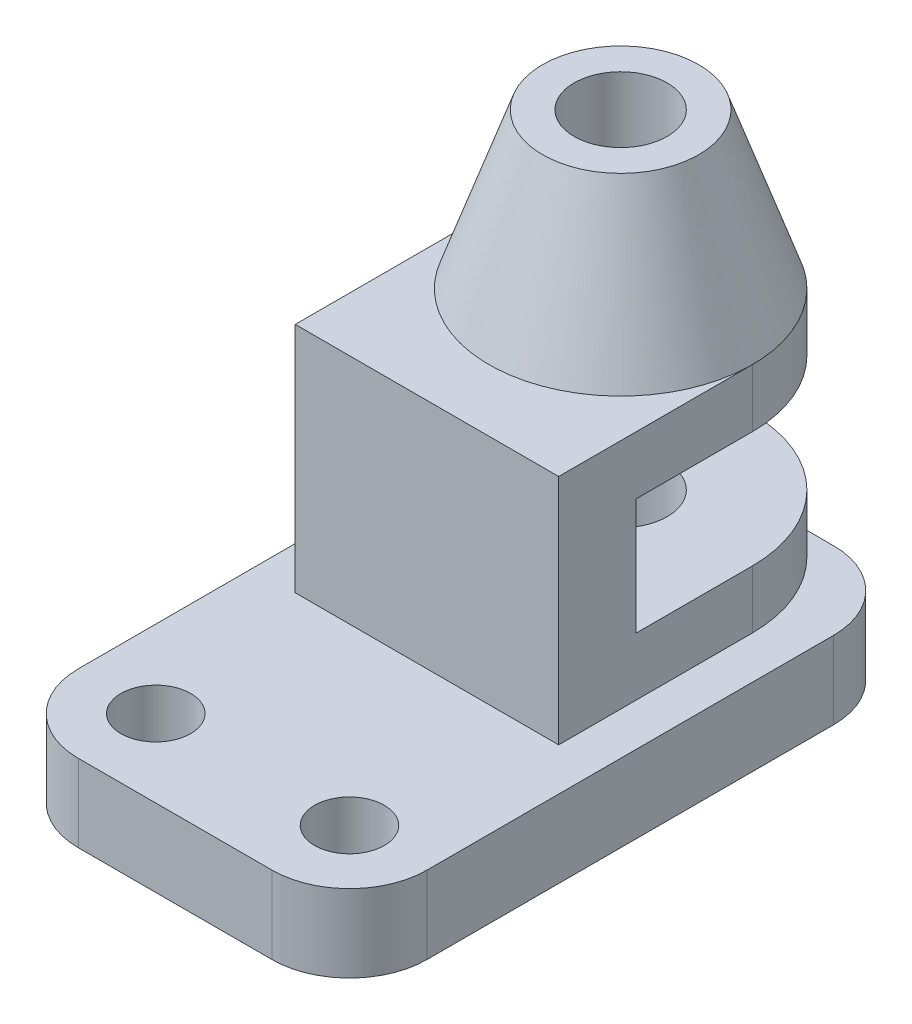
ISO-10303-21;
HEADER;
FILE_DESCRIPTION(('STEP AP214'),'2;1');
FILE_NAME('part.step','',(''),(''),'','','');
FILE_SCHEMA(('AUTOMOTIVE_DESIGN { 1 0 10303 214 1 1 1 1 }'));
ENDSEC;
DATA;
#1=APPLICATION_CONTEXT('core data for automotive mechanical design processes');
#2=APPLICATION_PROTOCOL_DEFINITION('international standard','automotive_design',2000,#1);
#3=PRODUCT_CONTEXT('',#1,'mechanical');
#4=PRODUCT('Part','Part','',(#3));
#5=PRODUCT_RELATED_PRODUCT_CATEGORY('part','',(#4));
#6=PRODUCT_DEFINITION_FORMATION('','',#4);
#7=PRODUCT_DEFINITION_CONTEXT('part definition',#1,'design');
#8=PRODUCT_DEFINITION('design','',#6,#7);
#9=PRODUCT_DEFINITION_SHAPE('','',#8);
#10=(LENGTH_UNIT() NAMED_UNIT(*) SI_UNIT(.MILLI.,.METRE.));
#11=(NAMED_UNIT(*) PLANE_ANGLE_UNIT() SI_UNIT($,.RADIAN.));
#12=(NAMED_UNIT(*) SI_UNIT($,.STERADIAN.) SOLID_ANGLE_UNIT());
#13=UNCERTAINTY_MEASURE_WITH_UNIT(LENGTH_MEASURE(1.E-05),#10,'distance_accuracy_value','');
#14=(GEOMETRIC_REPRESENTATION_CONTEXT(3) GLOBAL_UNCERTAINTY_ASSIGNED_CONTEXT((#13)) GLOBAL_UNIT_ASSIGNED_CONTEXT((#10,
#11,#12)) REPRESENTATION_CONTEXT('',''));
#15=CARTESIAN_POINT('',(0.,0.,0.));
#16=DIRECTION('',(0.,0.,1.));
#17=DIRECTION('',(1.,0.,0.));
#18=AXIS2_PLACEMENT_3D('',#15,#16,#17);
#19=CARTESIAN_POINT('',(16.2896405919663,120.,-115.));
#20=DIRECTION('',(0.,-1.,0.));
#21=DIRECTION('',(0.,0.,-1.));
#22=AXIS2_PLACEMENT_3D('',#19,#20,#21);
#23=PLANE('',#22);
#24=CARTESIAN_POINT('',(16.2896405919663,120.,-115.));
#25=DIRECTION('',(0.,1.,0.));
#26=DIRECTION('',(0.,0.,1.));
#27=AXIS2_PLACEMENT_3D('',#24,#25,#26);
#28=CIRCLE('',#27,12.);
#29=CARTESIAN_POINT('',(16.2896405919663,120.,-103.));
#30=VERTEX_POINT('',#29);
#31=EDGE_CURVE('E60',#30,#30,#28,.T.);
#32=ORIENTED_EDGE('',*,*,#31,.F.);
#33=EDGE_LOOP('',(#32));
#34=FACE_BOUND('',#33,.T.);
#35=CARTESIAN_POINT('',(16.2896405919663,120.,-115.));
#36=DIRECTION('',(0.,-1.,0.));
#37=DIRECTION('',(0.,0.,-1.));
#38=AXIS2_PLACEMENT_3D('',#35,#36,#37);
#39=CIRCLE('',#38,20.1495466843034);
#40=CARTESIAN_POINT('',(16.2896405919663,120.,-135.149546684303));
#41=VERTEX_POINT('',#40);
#42=EDGE_CURVE('E54',#41,#41,#39,.T.);
#43=ORIENTED_EDGE('',*,*,#42,.F.);
#44=EDGE_LOOP('',(#43));
#45=FACE_BOUND('',#44,.T.);
#46=ADVANCED_FACE('F47',(#34,#45),#23,.F.);
#47=CARTESIAN_POINT('',(16.2896405919663,80.,-149.));
#48=DIRECTION('',(0.,1.,0.));
#49=DIRECTION('',(0.,0.,1.));
#50=AXIS2_PLACEMENT_3D('',#47,#48,#49);
#51=PLANE('',#50);
#52=CARTESIAN_POINT('',(16.2896405919663,80.,-115.));
#53=DIRECTION('',(0.,1.,0.));
#54=DIRECTION('',(0.,0.,1.));
#55=AXIS2_PLACEMENT_3D('',#52,#53,#54);
#56=CIRCLE('',#55,12.);
#57=CARTESIAN_POINT('',(16.2896405919663,80.,-103.));
#58=VERTEX_POINT('',#57);
#59=EDGE_CURVE('E50',#58,#58,#56,.T.);
#60=ORIENTED_EDGE('',*,*,#59,.T.);
#61=EDGE_LOOP('',(#60));
#62=FACE_BOUND('',#61,.T.);
#63=CARTESIAN_POINT('',(16.2896405919663,80.,-115.));
#64=DIRECTION('',(0.,-1.,0.));
#65=DIRECTION('',(0.,0.,-1.));
#66=AXIS2_PLACEMENT_3D('',#63,#64,#65);
#67=CIRCLE('',#66,34.);
#68=CARTESIAN_POINT('',(16.2896405919663,80.,-149.));
#69=VERTEX_POINT('',#68);
#70=EDGE_CURVE('E11',#69,#69,#67,.T.);
#71=ORIENTED_EDGE('',*,*,#70,.T.);
#72=EDGE_LOOP('',(#71));
#73=FACE_BOUND('',#72,.T.);
#74=ADVANCED_FACE('F67',(#62,#73),#51,.F.);
#75=CARTESIAN_POINT('',(16.2896405919663,120.,-115.));
#76=DIRECTION('',(0.,-1.,0.));
#77=DIRECTION('',(0.,0.,-1.));
#78=AXIS2_PLACEMENT_3D('',#75,#76,#77);
#79=CONICAL_SURFACE('',#78,20.1495466843034,0.333340283437844);
#80=ORIENTED_EDGE('',*,*,#70,.F.);
#81=EDGE_LOOP('',(#80));
#82=FACE_BOUND('',#81,.T.);
#83=ORIENTED_EDGE('',*,*,#42,.T.);
#84=EDGE_LOOP('',(#83));
#85=FACE_BOUND('',#84,.T.);
#86=ADVANCED_FACE('F71',(#82,#85),#79,.T.);
#87=CARTESIAN_POINT('',(16.2896405919663,0.,-115.));
#88=DIRECTION('',(0.,1.,0.));
#89=DIRECTION('',(0.,0.,1.));
#90=AXIS2_PLACEMENT_3D('',#87,#88,#89);
#91=CYLINDRICAL_SURFACE('',#90,12.);
#92=CARTESIAN_POINT('',(16.2896405919663,120.,-103.));
#93=CARTESIAN_POINT('',(16.2896405919663,119.583333333333,-103.));
#94=CARTESIAN_POINT('',(16.2896405919663,119.166666666667,-103.));
#95=CARTESIAN_POINT('',(16.2896405919663,118.333333333333,-103.));
#96=CARTESIAN_POINT('',(16.2896405919663,117.916666666667,-103.));
#97=CARTESIAN_POINT('',(16.2896405919663,117.083333333333,-103.));
#98=CARTESIAN_POINT('',(16.2896405919663,116.666666666667,-103.));
#99=CARTESIAN_POINT('',(16.2896405919663,115.833333333333,-103.));
#100=CARTESIAN_POINT('',(16.2896405919663,115.416666666667,-103.));
#101=CARTESIAN_POINT('',(16.2896405919663,114.583333333333,-103.));
#102=CARTESIAN_POINT('',(16.2896405919663,114.166666666667,-103.));
#103=CARTESIAN_POINT('',(16.2896405919663,113.333333333333,-103.));
#104=CARTESIAN_POINT('',(16.2896405919663,112.916666666667,-103.));
#105=CARTESIAN_POINT('',(16.2896405919663,112.083333333333,-103.));
#106=CARTESIAN_POINT('',(16.2896405919663,111.666666666667,-103.));
#107=CARTESIAN_POINT('',(16.2896405919663,110.833333333333,-103.));
#108=CARTESIAN_POINT('',(16.2896405919663,110.416666666667,-103.));
#109=CARTESIAN_POINT('',(16.2896405919663,109.583333333333,-103.));
#110=CARTESIAN_POINT('',(16.2896405919663,109.166666666667,-103.));
#111=CARTESIAN_POINT('',(16.2896405919663,108.333333333333,-103.));
#112=CARTESIAN_POINT('',(16.2896405919663,107.916666666667,-103.));
#113=CARTESIAN_POINT('',(16.2896405919663,107.083333333333,-103.));
#114=CARTESIAN_POINT('',(16.2896405919663,106.666666666667,-103.));
#115=CARTESIAN_POINT('',(16.2896405919663,105.833333333333,-103.));
#116=CARTESIAN_POINT('',(16.2896405919663,105.416666666667,-103.));
#117=CARTESIAN_POINT('',(16.2896405919663,104.583333333333,-103.));
#118=CARTESIAN_POINT('',(16.2896405919663,104.166666666667,-103.));
#119=CARTESIAN_POINT('',(16.2896405919663,103.333333333333,-103.));
#120=CARTESIAN_POINT('',(16.2896405919663,102.916666666667,-103.));
#121=CARTESIAN_POINT('',(16.2896405919663,102.083333333333,-103.));
#122=CARTESIAN_POINT('',(16.2896405919663,101.666666666667,-103.));
#123=CARTESIAN_POINT('',(16.2896405919663,100.833333333333,-103.));
#124=CARTESIAN_POINT('',(16.2896405919663,100.416666666667,-103.));
#125=CARTESIAN_POINT('',(16.2896405919663,99.5833333333333,-103.));
#126=CARTESIAN_POINT('',(16.2896405919663,99.1666666666666,-103.));
#127=CARTESIAN_POINT('',(16.2896405919663,98.3333333333333,-103.));
#128=CARTESIAN_POINT('',(16.2896405919663,97.9166666666666,-103.));
#129=CARTESIAN_POINT('',(16.2896405919663,97.0833333333333,-103.));
#130=CARTESIAN_POINT('',(16.2896405919663,96.6666666666666,-103.));
#131=CARTESIAN_POINT('',(16.2896405919663,95.8333333333333,-103.));
#132=CARTESIAN_POINT('',(16.2896405919663,95.4166666666666,-103.));
#133=CARTESIAN_POINT('',(16.2896405919663,94.5833333333333,-103.));
#134=CARTESIAN_POINT('',(16.2896405919663,94.1666666666666,-103.));
#135=CARTESIAN_POINT('',(16.2896405919663,93.3333333333333,-103.));
#136=CARTESIAN_POINT('',(16.2896405919663,92.9166666666666,-103.));
#137=CARTESIAN_POINT('',(16.2896405919663,92.0833333333333,-103.));
#138=CARTESIAN_POINT('',(16.2896405919663,91.6666666666666,-103.));
#139=CARTESIAN_POINT('',(16.2896405919663,90.8333333333333,-103.));
#140=CARTESIAN_POINT('',(16.2896405919663,90.4166666666666,-103.));
#141=CARTESIAN_POINT('',(16.2896405919663,89.5833333333333,-103.));
#142=CARTESIAN_POINT('',(16.2896405919663,89.1666666666666,-103.));
#143=CARTESIAN_POINT('',(16.2896405919663,88.3333333333333,-103.));
#144=CARTESIAN_POINT('',(16.2896405919663,87.9166666666666,-103.));
#145=CARTESIAN_POINT('',(16.2896405919663,87.0833333333333,-103.));
#146=CARTESIAN_POINT('',(16.2896405919663,86.6666666666666,-103.));
#147=CARTESIAN_POINT('',(16.2896405919663,85.8333333333333,-103.));
#148=CARTESIAN_POINT('',(16.2896405919663,85.4166666666666,-103.));
#149=CARTESIAN_POINT('',(16.2896405919663,84.5833333333333,-103.));
#150=CARTESIAN_POINT('',(16.2896405919663,84.1666666666666,-103.));
#151=CARTESIAN_POINT('',(16.2896405919663,83.3333333333333,-103.));
#152=CARTESIAN_POINT('',(16.2896405919663,82.9166666666666,-103.));
#153=CARTESIAN_POINT('',(16.2896405919663,82.0833333333333,-103.));
#154=CARTESIAN_POINT('',(16.2896405919663,81.6666666666666,-103.));
#155=CARTESIAN_POINT('',(16.2896405919663,80.8333333333333,-103.));
#156=CARTESIAN_POINT('',(16.2896405919663,80.4166666666666,-103.));
#157=CARTESIAN_POINT('',(16.2896405919663,80.,-103.));
#158=B_SPLINE_CURVE_WITH_KNOTS('',3,(#92,#93,#94,#95,#96,#97,#98,#99,#100,#101,#102,#103,#104,
#105,#106,#107,#108,#109,#110,#111,#112,#113,#114,#115,#116,#117,#118,#119,#120,#121,#122,#123,
#124,#125,#126,#127,#128,#129,#130,#131,#132,#133,#134,#135,#136,#137,#138,#139,#140,#141,#142,
#143,#144,#145,#146,#147,#148,#149,#150,#151,#152,#153,#154,#155,#156,#157),.UNSPECIFIED.,.F.,
.F.,(4,2,2,2,2,2,2,2,2,2,2,2,2,2,2,2,2,2,2,2,2,2,2,2,2,2,2,2,2,2,2,2,4),(0.,1.25,2.5,3.75,5.,
6.25000000000001,7.50000000000001,8.75000000000001,10.,11.25,12.5,13.75,15.,16.25,17.5,18.75,
20.,21.25,22.5,23.75,25.,26.25,27.5,28.75,30.,31.25,32.5,33.75,35.,36.25,37.5,38.75,40.),.UNSPECIFIED.);
#159=EDGE_CURVE('BSEAM69',#30,#58,#158,.T.);
#160=ORIENTED_EDGE('',*,*,#31,.T.);
#161=ORIENTED_EDGE('',*,*,#59,.F.);
#162=ORIENTED_EDGE('',*,*,#159,.T.);
#163=ORIENTED_EDGE('',*,*,#159,.F.);
#164=EDGE_LOOP('',(#160,#162,#161,#163));
#165=FACE_BOUND('',#164,.T.);
#166=ADVANCED_FACE('F69',(#165),#91,.F.);
#167=CLOSED_SHELL('',(#46,#74,#86,#166));
#168=MANIFOLD_SOLID_BREP('B2',#167);
#169=CARTESIAN_POINT('',(0.,35.,0.));
#170=DIRECTION('',(0.,1.,0.));
#171=DIRECTION('',(0.,0.,1.));
#172=AXIS2_PLACEMENT_3D('',#169,#170,#171);
#173=PLANE('',#172);
#174=CARTESIAN_POINT('',(16.2896405919663,35.,-115.));
#175=DIRECTION('',(0.,1.,0.));
#176=DIRECTION('',(0.,0.,1.));
#177=AXIS2_PLACEMENT_3D('',#174,#175,#176);
#178=CIRCLE('',#177,12.);
#179=CARTESIAN_POINT('',(16.2896405919663,35.,-103.));
#180=VERTEX_POINT('',#179);
#181=EDGE_CURVE('E695',#180,#180,#178,.T.);
#182=ORIENTED_EDGE('',*,*,#181,.F.);
#183=EDGE_LOOP('',(#182));
#184=FACE_BOUND('',#183,.T.);
#185=DIRECTION('',(0.,0.,1.));
#186=VECTOR('',#185,1.);
#187=CARTESIAN_POINT('',(-17.7103594080337,35.,0.));
#188=LINE('',#187,#186);
#189=CARTESIAN_POINT('',(-17.7103594080338,35.,-115.));
#190=VERTEX_POINT('',#189);
#191=CARTESIAN_POINT('',(-17.7103594080337,35.,-85.));
#192=VERTEX_POINT('',#191);
#193=EDGE_CURVE('E292',#190,#192,#188,.T.);
#194=ORIENTED_EDGE('',*,*,#193,.T.);
#195=DIRECTION('',(1.,0.,0.));
#196=VECTOR('',#195,1.);
#197=CARTESIAN_POINT('',(-17.7103594080337,35.,-85.));
#198=LINE('',#197,#196);
#199=CARTESIAN_POINT('',(50.2896405919663,35.,-85.));
#200=VERTEX_POINT('',#199);
#201=EDGE_CURVE('E275',#192,#200,#198,.T.);
#202=ORIENTED_EDGE('',*,*,#201,.T.);
#203=DIRECTION('',(0.,0.,-1.));
#204=VECTOR('',#203,1.);
#205=CARTESIAN_POINT('',(50.2896405919662,35.,0.));
#206=LINE('',#205,#204);
#207=CARTESIAN_POINT('',(50.2896405919663,35.,-115.));
#208=VERTEX_POINT('',#207);
#209=EDGE_CURVE('E295',#200,#208,#206,.T.);
#210=ORIENTED_EDGE('',*,*,#209,.T.);
#211=CARTESIAN_POINT('',(16.2896405919662,35.,-115.));
#212=DIRECTION('',(0.,1.,0.));
#213=DIRECTION('',(0.,0.,-1.));
#214=AXIS2_PLACEMENT_3D('',#211,#212,#213);
#215=CIRCLE('',#214,34.);
#216=EDGE_CURVE('E277',#208,#190,#215,.T.);
#217=ORIENTED_EDGE('',*,*,#216,.T.);
#218=EDGE_LOOP('',(#194,#202,#210,#217));
#219=FACE_BOUND('',#218,.T.);
#220=ADVANCED_FACE('F117',(#184,#219),#173,.T.);
#221=CARTESIAN_POINT('',(41.2896405919662,20.,-20.));
#222=DIRECTION('',(0.,1.,0.));
#223=DIRECTION('',(0.,0.,1.));
#224=AXIS2_PLACEMENT_3D('',#221,#222,#223);
#225=PLANE('',#224);
#226=CARTESIAN_POINT('',(16.2896405919662,20.,-115.));
#227=DIRECTION('',(0.,1.,0.));
#228=DIRECTION('',(0.,0.,-1.));
#229=AXIS2_PLACEMENT_3D('',#226,#227,#228);
#230=CIRCLE('',#229,34.);
#231=CARTESIAN_POINT('',(50.2896405919663,20.,-115.));
#232=VERTEX_POINT('',#231);
#233=CARTESIAN_POINT('',(32.2896405919663,20.,-145.));
#234=VERTEX_POINT('',#233);
#235=EDGE_CURVE('E282',#232,#234,#230,.T.);
#236=ORIENTED_EDGE('',*,*,#235,.F.);
#237=DIRECTION('',(0.,0.,-1.));
#238=VECTOR('',#237,1.);
#239=CARTESIAN_POINT('',(50.2896405919662,20.,0.));
#240=LINE('',#239,#238);
#241=CARTESIAN_POINT('',(50.2896405919663,20.,-65.));
#242=VERTEX_POINT('',#241);
#243=EDGE_CURVE('E296',#242,#232,#240,.T.);
#244=ORIENTED_EDGE('',*,*,#243,.F.);
#245=DIRECTION('',(1.,0.,0.));
#246=VECTOR('',#245,1.);
#247=CARTESIAN_POINT('',(0.,20.,-65.));
#248=LINE('',#247,#246);
#249=CARTESIAN_POINT('',(-17.7103594080338,20.,-65.));
#250=VERTEX_POINT('',#249);
#251=EDGE_CURVE('E300',#250,#242,#248,.T.);
#252=ORIENTED_EDGE('',*,*,#251,.F.);
#253=DIRECTION('',(0.,0.,1.));
#254=VECTOR('',#253,1.);
#255=CARTESIAN_POINT('',(-17.7103594080337,20.,0.));
#256=LINE('',#255,#254);
#257=CARTESIAN_POINT('',(-17.7103594080338,20.,-115.));
#258=VERTEX_POINT('',#257);
#259=EDGE_CURVE('E291',#258,#250,#256,.T.);
#260=ORIENTED_EDGE('',*,*,#259,.F.);
#261=CARTESIAN_POINT('',(0.289640591966265,20.,-145.));
#262=VERTEX_POINT('',#261);
#263=EDGE_CURVE('E287',#262,#258,#230,.T.);
#264=ORIENTED_EDGE('',*,*,#263,.F.);
#265=DIRECTION('',(-1.,0.,0.));
#266=VECTOR('',#265,1.);
#267=CARTESIAN_POINT('',(41.2896405919662,20.,-145.));
#268=LINE('',#267,#266);
#269=CARTESIAN_POINT('',(-8.71035940803368,20.,-145.));
#270=VERTEX_POINT('',#269);
#271=EDGE_CURVE('E332',#262,#270,#268,.T.);
#272=ORIENTED_EDGE('',*,*,#271,.T.);
#273=CARTESIAN_POINT('',(-8.71035940803384,20.,-125.));
#274=DIRECTION('',(0.,1.,0.));
#275=DIRECTION('',(0.,0.,1.));
#276=AXIS2_PLACEMENT_3D('',#273,#274,#275);
#277=CIRCLE('',#276,20.);
#278=CARTESIAN_POINT('',(-28.7103594080338,20.,-125.));
#279=VERTEX_POINT('',#278);
#280=EDGE_CURVE('E336',#270,#279,#277,.T.);
#281=ORIENTED_EDGE('',*,*,#280,.T.);
#282=DIRECTION('',(0.,0.,1.));
#283=VECTOR('',#282,1.);
#284=CARTESIAN_POINT('',(-28.7103594080338,20.,-125.));
#285=LINE('',#284,#283);
#286=CARTESIAN_POINT('',(-28.7103594080338,20.,-20.0000000000001));
#287=VERTEX_POINT('',#286);
#288=EDGE_CURVE('E338',#279,#287,#285,.T.);
#289=ORIENTED_EDGE('',*,*,#288,.T.);
#290=CARTESIAN_POINT('',(-8.71035940803383,20.,-20.));
#291=DIRECTION('',(0.,1.,0.));
#292=DIRECTION('',(0.,0.,1.));
#293=AXIS2_PLACEMENT_3D('',#290,#291,#292);
#294=CIRCLE('',#293,20.);
#295=CARTESIAN_POINT('',(-8.71035940803369,20.,0.));
#296=VERTEX_POINT('',#295);
#297=EDGE_CURVE('E340',#287,#296,#294,.T.);
#298=ORIENTED_EDGE('',*,*,#297,.T.);
#299=DIRECTION('',(1.,0.,0.));
#300=VECTOR('',#299,1.);
#301=CARTESIAN_POINT('',(-8.71035940803369,20.,0.));
#302=LINE('',#301,#300);
#303=CARTESIAN_POINT('',(41.2896405919662,20.,0.));
#304=VERTEX_POINT('',#303);
#305=EDGE_CURVE('E342',#296,#304,#302,.T.);
#306=ORIENTED_EDGE('',*,*,#305,.T.);
#307=CARTESIAN_POINT('',(41.2896405919662,20.,-20.));
#308=DIRECTION('',(0.,1.,0.));
#309=DIRECTION('',(0.,0.,1.));
#310=AXIS2_PLACEMENT_3D('',#307,#308,#309);
#311=CIRCLE('',#310,20.);
#312=CARTESIAN_POINT('',(61.2896405919662,20.,-20.));
#313=VERTEX_POINT('',#312);
#314=EDGE_CURVE('E324',#304,#313,#311,.T.);
#315=ORIENTED_EDGE('',*,*,#314,.T.);
#316=DIRECTION('',(0.,0.,-1.));
#317=VECTOR('',#316,1.);
#318=CARTESIAN_POINT('',(61.2896405919662,20.,-20.));
#319=LINE('',#318,#317);
#320=CARTESIAN_POINT('',(61.2896405919662,20.,-125.));
#321=VERTEX_POINT('',#320);
#322=EDGE_CURVE('E327',#313,#321,#319,.T.);
#323=ORIENTED_EDGE('',*,*,#322,.T.);
#324=CARTESIAN_POINT('',(41.2896405919662,20.,-125.));
#325=DIRECTION('',(0.,1.,0.));
#326=DIRECTION('',(0.,0.,1.));
#327=AXIS2_PLACEMENT_3D('',#324,#325,#326);
#328=CIRCLE('',#327,20.);
#329=CARTESIAN_POINT('',(41.2896405919662,20.,-145.));
#330=VERTEX_POINT('',#329);
#331=EDGE_CURVE('E330',#321,#330,#328,.T.);
#332=ORIENTED_EDGE('',*,*,#331,.T.);
#333=EDGE_CURVE('E333',#330,#234,#268,.T.);
#334=ORIENTED_EDGE('',*,*,#333,.T.);
#335=EDGE_LOOP('',(#236,#244,#252,#260,#264,#272,#281,#289,#298,#306,#315,#323,#332,#334));
#336=FACE_BOUND('',#335,.T.);
#337=CARTESIAN_POINT('',(-8.71035940803383,20.,-20.));
#338=DIRECTION('',(0.,1.,0.));
#339=DIRECTION('',(0.,0.,1.));
#340=AXIS2_PLACEMENT_3D('',#337,#338,#339);
#341=CIRCLE('',#340,9.);
#342=CARTESIAN_POINT('',(-8.71035940803383,20.,-11.));
#343=VERTEX_POINT('',#342);
#344=EDGE_CURVE('E318',#343,#343,#341,.T.);
#345=ORIENTED_EDGE('',*,*,#344,.F.);
#346=EDGE_LOOP('',(#345));
#347=FACE_BOUND('',#346,.T.);
#348=CARTESIAN_POINT('',(41.2896405919662,20.,-20.));
#349=DIRECTION('',(0.,1.,0.));
#350=DIRECTION('',(0.,0.,1.));
#351=AXIS2_PLACEMENT_3D('',#348,#349,#350);
#352=CIRCLE('',#351,9.);
#353=CARTESIAN_POINT('',(41.2896405919662,20.,-11.));
#354=VERTEX_POINT('',#353);
#355=EDGE_CURVE('E312',#354,#354,#352,.T.);
#356=ORIENTED_EDGE('',*,*,#355,.F.);
#357=EDGE_LOOP('',(#356));
#358=FACE_BOUND('',#357,.T.);
#359=ADVANCED_FACE('F404',(#336,#347,#358),#225,.T.);
#360=CARTESIAN_POINT('',(41.2896405919662,0.,-20.));
#361=DIRECTION('',(0.,1.,0.));
#362=DIRECTION('',(0.,0.,1.));
#363=AXIS2_PLACEMENT_3D('',#360,#361,#362);
#364=PLANE('',#363);
#365=CARTESIAN_POINT('',(16.2896405919663,0.,-115.));
#366=DIRECTION('',(0.,1.,0.));
#367=DIRECTION('',(0.,0.,1.));
#368=AXIS2_PLACEMENT_3D('',#365,#366,#367);
#369=CIRCLE('',#368,12.);
#370=CARTESIAN_POINT('',(16.2896405919663,0.,-103.));
#371=VERTEX_POINT('',#370);
#372=EDGE_CURVE('E121',#371,#371,#369,.T.);
#373=ORIENTED_EDGE('',*,*,#372,.T.);
#374=EDGE_LOOP('',(#373));
#375=FACE_BOUND('',#374,.T.);
#376=CARTESIAN_POINT('',(41.2896405919662,0.,-20.));
#377=DIRECTION('',(0.,1.,0.));
#378=DIRECTION('',(0.,0.,1.));
#379=AXIS2_PLACEMENT_3D('',#376,#377,#378);
#380=CIRCLE('',#379,20.);
#381=CARTESIAN_POINT('',(41.2896405919662,0.,0.));
#382=VERTEX_POINT('',#381);
#383=CARTESIAN_POINT('',(61.2896405919662,0.,-20.));
#384=VERTEX_POINT('',#383);
#385=EDGE_CURVE('E321',#382,#384,#380,.T.);
#386=ORIENTED_EDGE('',*,*,#385,.F.);
#387=DIRECTION('',(1.,0.,0.));
#388=VECTOR('',#387,1.);
#389=CARTESIAN_POINT('',(-8.71035940803369,0.,0.));
#390=LINE('',#389,#388);
#391=CARTESIAN_POINT('',(-8.71035940803369,0.,0.));
#392=VERTEX_POINT('',#391);
#393=EDGE_CURVE('E328',#392,#382,#390,.T.);
#394=ORIENTED_EDGE('',*,*,#393,.F.);
#395=CARTESIAN_POINT('',(-8.71035940803383,0.,-20.));
#396=DIRECTION('',(0.,1.,0.));
#397=DIRECTION('',(0.,0.,1.));
#398=AXIS2_PLACEMENT_3D('',#395,#396,#397);
#399=CIRCLE('',#398,20.);
#400=CARTESIAN_POINT('',(-28.7103594080338,0.,-20.0000000000001));
#401=VERTEX_POINT('',#400);
#402=EDGE_CURVE('E357',#401,#392,#399,.T.);
#403=ORIENTED_EDGE('',*,*,#402,.F.);
#404=DIRECTION('',(0.,0.,1.));
#405=VECTOR('',#404,1.);
#406=CARTESIAN_POINT('',(-28.7103594080338,0.,-125.));
#407=LINE('',#406,#405);
#408=CARTESIAN_POINT('',(-28.7103594080338,0.,-125.));
#409=VERTEX_POINT('',#408);
#410=EDGE_CURVE('E355',#409,#401,#407,.T.);
#411=ORIENTED_EDGE('',*,*,#410,.F.);
#412=CARTESIAN_POINT('',(-8.71035940803384,0.,-125.));
#413=DIRECTION('',(0.,1.,0.));
#414=DIRECTION('',(0.,0.,1.));
#415=AXIS2_PLACEMENT_3D('',#412,#413,#414);
#416=CIRCLE('',#415,20.);
#417=CARTESIAN_POINT('',(-8.71035940803368,0.,-145.));
#418=VERTEX_POINT('',#417);
#419=EDGE_CURVE('E353',#418,#409,#416,.T.);
#420=ORIENTED_EDGE('',*,*,#419,.F.);
#421=DIRECTION('',(-1.,0.,0.));
#422=VECTOR('',#421,1.);
#423=CARTESIAN_POINT('',(41.2896405919662,0.,-145.));
#424=LINE('',#423,#422);
#425=CARTESIAN_POINT('',(41.2896405919662,0.,-145.));
#426=VERTEX_POINT('',#425);
#427=EDGE_CURVE('E351',#426,#418,#424,.T.);
#428=ORIENTED_EDGE('',*,*,#427,.F.);
#429=CARTESIAN_POINT('',(41.2896405919662,0.,-125.));
#430=DIRECTION('',(0.,1.,0.));
#431=DIRECTION('',(0.,0.,1.));
#432=AXIS2_PLACEMENT_3D('',#429,#430,#431);
#433=CIRCLE('',#432,20.);
#434=CARTESIAN_POINT('',(61.2896405919662,0.,-125.));
#435=VERTEX_POINT('',#434);
#436=EDGE_CURVE('E349',#435,#426,#433,.T.);
#437=ORIENTED_EDGE('',*,*,#436,.F.);
#438=DIRECTION('',(0.,0.,-1.));
#439=VECTOR('',#438,1.);
#440=CARTESIAN_POINT('',(61.2896405919662,0.,-20.));
#441=LINE('',#440,#439);
#442=EDGE_CURVE('E347',#384,#435,#441,.T.);
#443=ORIENTED_EDGE('',*,*,#442,.F.);
#444=EDGE_LOOP('',(#386,#394,#403,#411,#420,#428,#437,#443));
#445=FACE_BOUND('',#444,.T.);
#446=CARTESIAN_POINT('',(-8.71035940803383,0.,-20.));
#447=DIRECTION('',(0.,1.,0.));
#448=DIRECTION('',(0.,0.,1.));
#449=AXIS2_PLACEMENT_3D('',#446,#447,#448);
#450=CIRCLE('',#449,9.);
#451=CARTESIAN_POINT('',(-8.71035940803383,0.,-11.));
#452=VERTEX_POINT('',#451);
#453=EDGE_CURVE('E315',#452,#452,#450,.T.);
#454=ORIENTED_EDGE('',*,*,#453,.T.);
#455=EDGE_LOOP('',(#454));
#456=FACE_BOUND('',#455,.T.);
#457=CARTESIAN_POINT('',(41.2896405919662,0.,-20.));
#458=DIRECTION('',(0.,1.,0.));
#459=DIRECTION('',(0.,0.,1.));
#460=AXIS2_PLACEMENT_3D('',#457,#458,#459);
#461=CIRCLE('',#460,9.);
#462=CARTESIAN_POINT('',(41.2896405919662,0.,-11.));
#463=VERTEX_POINT('',#462);
#464=EDGE_CURVE('E311',#463,#463,#461,.T.);
#465=ORIENTED_EDGE('',*,*,#464,.T.);
#466=EDGE_LOOP('',(#465));
#467=FACE_BOUND('',#466,.T.);
#468=ADVANCED_FACE('F388',(#375,#445,#456,#467),#364,.F.);
#469=CARTESIAN_POINT('',(41.2896405919662,20.,-20.));
#470=DIRECTION('',(0.,-1.,0.));
#471=DIRECTION('',(0.,0.,-1.));
#472=AXIS2_PLACEMENT_3D('',#469,#470,#471);
#473=CYLINDRICAL_SURFACE('',#472,20.);
#474=ORIENTED_EDGE('',*,*,#385,.T.);
#475=DIRECTION('',(0.,-1.,0.));
#476=VECTOR('',#475,1.);
#477=CARTESIAN_POINT('',(61.2896405919662,20.,-20.));
#478=LINE('',#477,#476);
#479=EDGE_CURVE('E45',#313,#384,#478,.T.);
#480=ORIENTED_EDGE('',*,*,#479,.F.);
#481=ORIENTED_EDGE('',*,*,#314,.F.);
#482=DIRECTION('',(0.,-1.,0.));
#483=VECTOR('',#482,1.);
#484=CARTESIAN_POINT('',(41.2896405919662,20.,0.));
#485=LINE('',#484,#483);
#486=EDGE_CURVE('E344',#304,#382,#485,.T.);
#487=ORIENTED_EDGE('',*,*,#486,.T.);
#488=EDGE_LOOP('',(#474,#480,#481,#487));
#489=FACE_BOUND('',#488,.T.);
#490=ADVANCED_FACE('F119',(#489),#473,.T.);
#491=CARTESIAN_POINT('',(61.2896405919662,20.,-20.));
#492=DIRECTION('',(-1.,0.,0.));
#493=DIRECTION('',(0.,0.,1.));
#494=AXIS2_PLACEMENT_3D('',#491,#492,#493);
#495=PLANE('',#494);
#496=ORIENTED_EDGE('',*,*,#442,.T.);
#497=DIRECTION('',(0.,-1.,0.));
#498=VECTOR('',#497,1.);
#499=CARTESIAN_POINT('',(61.2896405919662,20.,-125.));
#500=LINE('',#499,#498);
#501=EDGE_CURVE('E126',#321,#435,#500,.T.);
#502=ORIENTED_EDGE('',*,*,#501,.F.);
#503=ORIENTED_EDGE('',*,*,#322,.F.);
#504=ORIENTED_EDGE('',*,*,#479,.T.);
#505=EDGE_LOOP('',(#496,#502,#503,#504));
#506=FACE_BOUND('',#505,.T.);
#507=ADVANCED_FACE('F414',(#506),#495,.F.);
#508=CARTESIAN_POINT('',(41.2896405919662,20.,-125.));
#509=DIRECTION('',(0.,-1.,0.));
#510=DIRECTION('',(0.,0.,-1.));
#511=AXIS2_PLACEMENT_3D('',#508,#509,#510);
#512=CYLINDRICAL_SURFACE('',#511,20.);
#513=ORIENTED_EDGE('',*,*,#436,.T.);
#514=DIRECTION('',(0.,-1.,0.));
#515=VECTOR('',#514,1.);
#516=CARTESIAN_POINT('',(41.2896405919662,20.,-145.));
#517=LINE('',#516,#515);
#518=EDGE_CURVE('E374',#330,#426,#517,.T.);
#519=ORIENTED_EDGE('',*,*,#518,.F.);
#520=ORIENTED_EDGE('',*,*,#331,.F.);
#521=ORIENTED_EDGE('',*,*,#501,.T.);
#522=EDGE_LOOP('',(#513,#519,#520,#521));
#523=FACE_BOUND('',#522,.T.);
#524=ADVANCED_FACE('F382',(#523),#512,.T.);
#525=CARTESIAN_POINT('',(41.2896405919662,20.,-145.));
#526=DIRECTION('',(0.,0.,1.));
#527=DIRECTION('',(1.,0.,0.));
#528=AXIS2_PLACEMENT_3D('',#525,#526,#527);
#529=PLANE('',#528);
#530=ORIENTED_EDGE('',*,*,#427,.T.);
#531=DIRECTION('',(0.,-1.,0.));
#532=VECTOR('',#531,1.);
#533=CARTESIAN_POINT('',(-8.71035940803368,20.,-145.));
#534=LINE('',#533,#532);
#535=EDGE_CURVE('E371',#270,#418,#534,.T.);
#536=ORIENTED_EDGE('',*,*,#535,.F.);
#537=ORIENTED_EDGE('',*,*,#271,.F.);
#538=DIRECTION('',(1.,0.,0.));
#539=VECTOR('',#538,1.);
#540=CARTESIAN_POINT('',(41.2896405919662,20.,-145.));
#541=LINE('',#540,#539);
#542=EDGE_CURVE('E285',#262,#234,#541,.T.);
#543=ORIENTED_EDGE('',*,*,#542,.T.);
#544=ORIENTED_EDGE('',*,*,#333,.F.);
#545=ORIENTED_EDGE('',*,*,#518,.T.);
#546=EDGE_LOOP('',(#530,#536,#537,#543,#544,#545));
#547=FACE_BOUND('',#546,.T.);
#548=ADVANCED_FACE('F394',(#547),#529,.F.);
#549=CARTESIAN_POINT('',(-8.71035940803384,20.,-125.));
#550=DIRECTION('',(0.,-1.,0.));
#551=DIRECTION('',(0.,0.,-1.));
#552=AXIS2_PLACEMENT_3D('',#549,#550,#551);
#553=CYLINDRICAL_SURFACE('',#552,20.);
#554=ORIENTED_EDGE('',*,*,#419,.T.);
#555=DIRECTION('',(0.,-1.,0.));
#556=VECTOR('',#555,1.);
#557=CARTESIAN_POINT('',(-28.7103594080338,20.,-125.));
#558=LINE('',#557,#556);
#559=EDGE_CURVE('E368',#279,#409,#558,.T.);
#560=ORIENTED_EDGE('',*,*,#559,.F.);
#561=ORIENTED_EDGE('',*,*,#280,.F.);
#562=ORIENTED_EDGE('',*,*,#535,.T.);
#563=EDGE_LOOP('',(#554,#560,#561,#562));
#564=FACE_BOUND('',#563,.T.);
#565=ADVANCED_FACE('F399',(#564),#553,.T.);
#566=CARTESIAN_POINT('',(-28.7103594080338,20.,-125.));
#567=DIRECTION('',(1.,0.,0.));
#568=DIRECTION('',(0.,0.,-1.));
#569=AXIS2_PLACEMENT_3D('',#566,#567,#568);
#570=PLANE('',#569);
#571=ORIENTED_EDGE('',*,*,#410,.T.);
#572=DIRECTION('',(0.,-1.,0.));
#573=VECTOR('',#572,1.);
#574=CARTESIAN_POINT('',(-28.7103594080338,20.,-20.0000000000001));
#575=LINE('',#574,#573);
#576=EDGE_CURVE('E365',#287,#401,#575,.T.);
#577=ORIENTED_EDGE('',*,*,#576,.F.);
#578=ORIENTED_EDGE('',*,*,#288,.F.);
#579=ORIENTED_EDGE('',*,*,#559,.T.);
#580=EDGE_LOOP('',(#571,#577,#578,#579));
#581=FACE_BOUND('',#580,.T.);
#582=ADVANCED_FACE('F427',(#581),#570,.F.);
#583=CARTESIAN_POINT('',(-8.71035940803383,20.,-20.));
#584=DIRECTION('',(0.,-1.,0.));
#585=DIRECTION('',(0.,0.,-1.));
#586=AXIS2_PLACEMENT_3D('',#583,#584,#585);
#587=CYLINDRICAL_SURFACE('',#586,20.);
#588=ORIENTED_EDGE('',*,*,#402,.T.);
#589=DIRECTION('',(0.,-1.,0.));
#590=VECTOR('',#589,1.);
#591=CARTESIAN_POINT('',(-8.71035940803369,20.,0.));
#592=LINE('',#591,#590);
#593=EDGE_CURVE('E362',#296,#392,#592,.T.);
#594=ORIENTED_EDGE('',*,*,#593,.F.);
#595=ORIENTED_EDGE('',*,*,#297,.F.);
#596=ORIENTED_EDGE('',*,*,#576,.T.);
#597=EDGE_LOOP('',(#588,#594,#595,#596));
#598=FACE_BOUND('',#597,.T.);
#599=ADVANCED_FACE('F425',(#598),#587,.T.);
#600=CARTESIAN_POINT('',(-8.71035940803369,20.,0.));
#601=DIRECTION('',(0.,0.,-1.));
#602=DIRECTION('',(-1.,0.,0.));
#603=AXIS2_PLACEMENT_3D('',#600,#601,#602);
#604=PLANE('',#603);
#605=ORIENTED_EDGE('',*,*,#393,.T.);
#606=ORIENTED_EDGE('',*,*,#486,.F.);
#607=ORIENTED_EDGE('',*,*,#305,.F.);
#608=ORIENTED_EDGE('',*,*,#593,.T.);
#609=EDGE_LOOP('',(#605,#606,#607,#608));
#610=FACE_BOUND('',#609,.T.);
#611=ADVANCED_FACE('F420',(#610),#604,.F.);
#612=CARTESIAN_POINT('',(-8.71035940803383,20.,-20.));
#613=DIRECTION('',(0.,-1.,0.));
#614=DIRECTION('',(0.,0.,-1.));
#615=AXIS2_PLACEMENT_3D('',#612,#613,#614);
#616=CYLINDRICAL_SURFACE('',#615,9.);
#617=ORIENTED_EDGE('',*,*,#344,.T.);
#618=EDGE_LOOP('',(#617));
#619=FACE_BOUND('',#618,.T.);
#620=ORIENTED_EDGE('',*,*,#453,.F.);
#621=EDGE_LOOP('',(#620));
#622=FACE_BOUND('',#621,.T.);
#623=ADVANCED_FACE('F462',(#619,#622),#616,.F.);
#624=CARTESIAN_POINT('',(41.2896405919662,20.,-20.));
#625=DIRECTION('',(0.,-1.,0.));
#626=DIRECTION('',(0.,0.,-1.));
#627=AXIS2_PLACEMENT_3D('',#624,#625,#626);
#628=CYLINDRICAL_SURFACE('',#627,9.);
#629=ORIENTED_EDGE('',*,*,#355,.T.);
#630=EDGE_LOOP('',(#629));
#631=FACE_BOUND('',#630,.T.);
#632=ORIENTED_EDGE('',*,*,#464,.F.);
#633=EDGE_LOOP('',(#632));
#634=FACE_BOUND('',#633,.T.);
#635=ADVANCED_FACE('F459',(#631,#634),#628,.F.);
#636=CARTESIAN_POINT('',(-17.7103594080337,35.,0.));
#637=DIRECTION('',(1.,0.,0.));
#638=DIRECTION('',(0.,0.,-1.));
#639=AXIS2_PLACEMENT_3D('',#636,#637,#638);
#640=PLANE('',#639);
#641=ORIENTED_EDGE('',*,*,#259,.T.);
#642=DIRECTION('',(0.,-1.,0.));
#643=VECTOR('',#642,1.);
#644=CARTESIAN_POINT('',(-17.7103594080338,35.,-65.));
#645=LINE('',#644,#643);
#646=CARTESIAN_POINT('',(-17.7103594080337,80.,-65.));
#647=VERTEX_POINT('',#646);
#648=EDGE_CURVE('E305',#647,#250,#645,.T.);
#649=ORIENTED_EDGE('',*,*,#648,.F.);
#650=DIRECTION('',(0.,0.,-1.));
#651=VECTOR('',#650,1.);
#652=CARTESIAN_POINT('',(-17.7103594080338,80.,0.));
#653=LINE('',#652,#651);
#654=CARTESIAN_POINT('',(-17.7103594080338,80.,-115.));
#655=VERTEX_POINT('',#654);
#656=EDGE_CURVE('E257',#647,#655,#653,.T.);
#657=ORIENTED_EDGE('',*,*,#656,.T.);
#658=DIRECTION('',(0.,-1.,0.));
#659=VECTOR('',#658,1.);
#660=CARTESIAN_POINT('',(-17.7103594080337,0.,-115.));
#661=LINE('',#660,#659);
#662=CARTESIAN_POINT('',(-17.7103594080338,65.,-115.));
#663=VERTEX_POINT('',#662);
#664=EDGE_CURVE('E242',#655,#663,#661,.T.);
#665=ORIENTED_EDGE('',*,*,#664,.T.);
#666=DIRECTION('',(0.,0.,1.));
#667=VECTOR('',#666,1.);
#668=CARTESIAN_POINT('',(-17.7103594080338,65.,0.));
#669=LINE('',#668,#667);
#670=CARTESIAN_POINT('',(-17.7103594080337,65.,-85.));
#671=VERTEX_POINT('',#670);
#672=EDGE_CURVE('E254',#663,#671,#669,.T.);
#673=ORIENTED_EDGE('',*,*,#672,.T.);
#674=DIRECTION('',(0.,-1.,0.));
#675=VECTOR('',#674,1.);
#676=CARTESIAN_POINT('',(-17.7103594080337,0.,-85.));
#677=LINE('',#676,#675);
#678=EDGE_CURVE('E262',#671,#192,#677,.T.);
#679=ORIENTED_EDGE('',*,*,#678,.T.);
#680=ORIENTED_EDGE('',*,*,#193,.F.);
#681=DIRECTION('',(0.,-1.,0.));
#682=VECTOR('',#681,1.);
#683=CARTESIAN_POINT('',(-17.7103594080338,35.,-115.));
#684=LINE('',#683,#682);
#685=EDGE_CURVE('E308',#190,#258,#684,.T.);
#686=ORIENTED_EDGE('',*,*,#685,.T.);
#687=EDGE_LOOP('',(#641,#649,#657,#665,#673,#679,#680,#686));
#688=FACE_BOUND('',#687,.T.);
#689=ADVANCED_FACE('F253',(#688),#640,.F.);
#690=CARTESIAN_POINT('',(0.,35.,-65.));
#691=DIRECTION('',(0.,0.,-1.));
#692=DIRECTION('',(-1.,0.,0.));
#693=AXIS2_PLACEMENT_3D('',#690,#691,#692);
#694=PLANE('',#693);
#695=ORIENTED_EDGE('',*,*,#251,.T.);
#696=DIRECTION('',(0.,-1.,0.));
#697=VECTOR('',#696,1.);
#698=CARTESIAN_POINT('',(50.2896405919662,35.,-65.));
#699=LINE('',#698,#697);
#700=CARTESIAN_POINT('',(50.2896405919663,80.,-65.));
#701=VERTEX_POINT('',#700);
#702=EDGE_CURVE('E141',#701,#242,#699,.T.);
#703=ORIENTED_EDGE('',*,*,#702,.F.);
#704=DIRECTION('',(1.,0.,0.));
#705=VECTOR('',#704,1.);
#706=CARTESIAN_POINT('',(-17.7103594080337,80.,-65.));
#707=LINE('',#706,#705);
#708=EDGE_CURVE('E278',#647,#701,#707,.T.);
#709=ORIENTED_EDGE('',*,*,#708,.F.);
#710=ORIENTED_EDGE('',*,*,#648,.T.);
#711=EDGE_LOOP('',(#695,#703,#709,#710));
#712=FACE_BOUND('',#711,.T.);
#713=ADVANCED_FACE('F453',(#712),#694,.F.);
#714=CARTESIAN_POINT('',(50.2896405919662,35.,0.));
#715=DIRECTION('',(-1.,0.,0.));
#716=DIRECTION('',(0.,0.,1.));
#717=AXIS2_PLACEMENT_3D('',#714,#715,#716);
#718=PLANE('',#717);
#719=ORIENTED_EDGE('',*,*,#243,.T.);
#720=DIRECTION('',(0.,-1.,0.));
#721=VECTOR('',#720,1.);
#722=CARTESIAN_POINT('',(50.2896405919663,35.,-115.));
#723=LINE('',#722,#721);
#724=EDGE_CURVE('E298',#208,#232,#723,.T.);
#725=ORIENTED_EDGE('',*,*,#724,.F.);
#726=ORIENTED_EDGE('',*,*,#209,.F.);
#727=DIRECTION('',(0.,-1.,0.));
#728=VECTOR('',#727,1.);
#729=CARTESIAN_POINT('',(50.2896405919663,0.,-85.));
#730=LINE('',#729,#728);
#731=CARTESIAN_POINT('',(50.2896405919663,65.,-85.));
#732=VERTEX_POINT('',#731);
#733=EDGE_CURVE('E133',#732,#200,#730,.T.);
#734=ORIENTED_EDGE('',*,*,#733,.F.);
#735=DIRECTION('',(0.,0.,1.));
#736=VECTOR('',#735,1.);
#737=CARTESIAN_POINT('',(50.2896405919662,65.,0.));
#738=LINE('',#737,#736);
#739=CARTESIAN_POINT('',(50.2896405919663,65.,-115.));
#740=VERTEX_POINT('',#739);
#741=EDGE_CURVE('E270',#740,#732,#738,.T.);
#742=ORIENTED_EDGE('',*,*,#741,.F.);
#743=DIRECTION('',(0.,-1.,0.));
#744=VECTOR('',#743,1.);
#745=CARTESIAN_POINT('',(50.2896405919663,0.,-115.));
#746=LINE('',#745,#744);
#747=CARTESIAN_POINT('',(50.2896405919663,80.,-115.));
#748=VERTEX_POINT('',#747);
#749=EDGE_CURVE('E245',#748,#740,#746,.T.);
#750=ORIENTED_EDGE('',*,*,#749,.F.);
#751=DIRECTION('',(0.,0.,-1.));
#752=VECTOR('',#751,1.);
#753=CARTESIAN_POINT('',(50.2896405919662,80.,0.));
#754=LINE('',#753,#752);
#755=EDGE_CURVE('E264',#701,#748,#754,.T.);
#756=ORIENTED_EDGE('',*,*,#755,.F.);
#757=ORIENTED_EDGE('',*,*,#702,.T.);
#758=EDGE_LOOP('',(#719,#725,#726,#734,#742,#750,#756,#757));
#759=FACE_BOUND('',#758,.T.);
#760=ADVANCED_FACE('F449',(#759),#718,.F.);
#761=CARTESIAN_POINT('',(16.2896405919662,20.,-115.));
#762=DIRECTION('',(0.,-1.,0.));
#763=DIRECTION('',(0.,0.,-1.));
#764=AXIS2_PLACEMENT_3D('',#761,#762,#763);
#765=PLANE('',#764);
#766=ORIENTED_EDGE('',*,*,#542,.F.);
#767=EDGE_CURVE('E286',#234,#262,#230,.T.);
#768=ORIENTED_EDGE('',*,*,#767,.F.);
#769=EDGE_LOOP('',(#766,#768));
#770=FACE_BOUND('',#769,.T.);
#771=ADVANCED_FACE('F452',(#770),#765,.T.);
#772=CARTESIAN_POINT('',(16.2896405919662,20.,-115.));
#773=DIRECTION('',(0.,1.,0.));
#774=DIRECTION('',(0.,0.,1.));
#775=AXIS2_PLACEMENT_3D('',#772,#773,#774);
#776=CYLINDRICAL_SURFACE('',#775,34.);
#777=ORIENTED_EDGE('',*,*,#216,.F.);
#778=ORIENTED_EDGE('',*,*,#724,.T.);
#779=ORIENTED_EDGE('',*,*,#235,.T.);
#780=ORIENTED_EDGE('',*,*,#767,.T.);
#781=ORIENTED_EDGE('',*,*,#263,.T.);
#782=ORIENTED_EDGE('',*,*,#685,.F.);
#783=EDGE_LOOP('',(#777,#778,#779,#780,#781,#782));
#784=FACE_BOUND('',#783,.T.);
#785=ADVANCED_FACE('F447',(#784),#776,.T.);
#786=CARTESIAN_POINT('',(-17.7103594080337,0.,-85.));
#787=DIRECTION('',(0.,0.,1.));
#788=DIRECTION('',(1.,0.,0.));
#789=AXIS2_PLACEMENT_3D('',#786,#787,#788);
#790=PLANE('',#789);
#791=ORIENTED_EDGE('',*,*,#733,.T.);
#792=ORIENTED_EDGE('',*,*,#201,.F.);
#793=ORIENTED_EDGE('',*,*,#678,.F.);
#794=DIRECTION('',(1.,0.,0.));
#795=VECTOR('',#794,1.);
#796=CARTESIAN_POINT('',(-17.7103594080337,65.,-85.));
#797=LINE('',#796,#795);
#798=EDGE_CURVE('E260',#671,#732,#797,.T.);
#799=ORIENTED_EDGE('',*,*,#798,.T.);
#800=EDGE_LOOP('',(#791,#792,#793,#799));
#801=FACE_BOUND('',#800,.T.);
#802=ADVANCED_FACE('F510',(#801),#790,.F.);
#803=CARTESIAN_POINT('',(-17.7103594080338,80.,0.));
#804=DIRECTION('',(0.,-1.,0.));
#805=DIRECTION('',(0.,0.,-1.));
#806=AXIS2_PLACEMENT_3D('',#803,#804,#805);
#807=PLANE('',#806);
#808=ORIENTED_EDGE('',*,*,#755,.T.);
#809=CARTESIAN_POINT('',(16.2896405919663,80.,-115.));
#810=DIRECTION('',(0.,1.,0.));
#811=DIRECTION('',(0.,0.,-1.));
#812=AXIS2_PLACEMENT_3D('',#809,#810,#811);
#813=CIRCLE('',#812,34.);
#814=EDGE_CURVE('E249',#748,#655,#813,.T.);
#815=ORIENTED_EDGE('',*,*,#814,.T.);
#816=ORIENTED_EDGE('',*,*,#656,.F.);
#817=ORIENTED_EDGE('',*,*,#708,.T.);
#818=EDGE_LOOP('',(#808,#815,#816,#817));
#819=FACE_BOUND('',#818,.T.);
#820=ADVANCED_FACE('F516',(#819),#807,.F.);
#821=CARTESIAN_POINT('',(-17.7103594080338,65.,0.));
#822=DIRECTION('',(0.,1.,0.));
#823=DIRECTION('',(0.,0.,1.));
#824=AXIS2_PLACEMENT_3D('',#821,#822,#823);
#825=PLANE('',#824);
#826=ORIENTED_EDGE('',*,*,#741,.T.);
#827=ORIENTED_EDGE('',*,*,#798,.F.);
#828=ORIENTED_EDGE('',*,*,#672,.F.);
#829=CARTESIAN_POINT('',(16.2896405919663,65.,-115.));
#830=DIRECTION('',(0.,1.,0.));
#831=DIRECTION('',(0.,0.,-1.));
#832=AXIS2_PLACEMENT_3D('',#829,#830,#831);
#833=CIRCLE('',#832,34.);
#834=EDGE_CURVE('E239',#740,#663,#833,.T.);
#835=ORIENTED_EDGE('',*,*,#834,.F.);
#836=EDGE_LOOP('',(#826,#827,#828,#835));
#837=FACE_BOUND('',#836,.T.);
#838=ADVANCED_FACE('F259',(#837),#825,.F.);
#839=CARTESIAN_POINT('',(16.2896405919663,65.,-115.));
#840=DIRECTION('',(0.,1.,0.));
#841=DIRECTION('',(0.,0.,1.));
#842=AXIS2_PLACEMENT_3D('',#839,#840,#841);
#843=CYLINDRICAL_SURFACE('',#842,34.);
#844=ORIENTED_EDGE('',*,*,#814,.F.);
#845=ORIENTED_EDGE('',*,*,#749,.T.);
#846=ORIENTED_EDGE('',*,*,#834,.T.);
#847=ORIENTED_EDGE('',*,*,#664,.F.);
#848=EDGE_LOOP('',(#844,#845,#846,#847));
#849=FACE_BOUND('',#848,.T.);
#850=ADVANCED_FACE('F241',(#849),#843,.T.);
#851=CARTESIAN_POINT('',(16.2896405919663,-5.,-115.));
#852=DIRECTION('',(0.,1.,0.));
#853=DIRECTION('',(0.,0.,1.));
#854=AXIS2_PLACEMENT_3D('',#851,#852,#853);
#855=CYLINDRICAL_SURFACE('',#854,12.);
#856=ORIENTED_EDGE('',*,*,#181,.T.);
#857=EDGE_LOOP('',(#856));
#858=FACE_BOUND('',#857,.T.);
#859=ORIENTED_EDGE('',*,*,#372,.F.);
#860=EDGE_LOOP('',(#859));
#861=FACE_BOUND('',#860,.T.);
#862=ADVANCED_FACE('F535',(#858,#861),#855,.F.);
#863=CLOSED_SHELL('',(#220,#359,#468,#490,#507,#524,#548,#565,#582,#599,#611,#623,#635,#689,
#713,#760,#771,#785,#802,#820,#838,#850,#862));
#864=MANIFOLD_SOLID_BREP('B6',#863);
#865=ADVANCED_BREP_SHAPE_REPRESENTATION('',(#18,#168,#864),#14);
#866=SHAPE_DEFINITION_REPRESENTATION(#9,#865);
ENDSEC;
END-ISO-10303-21;
